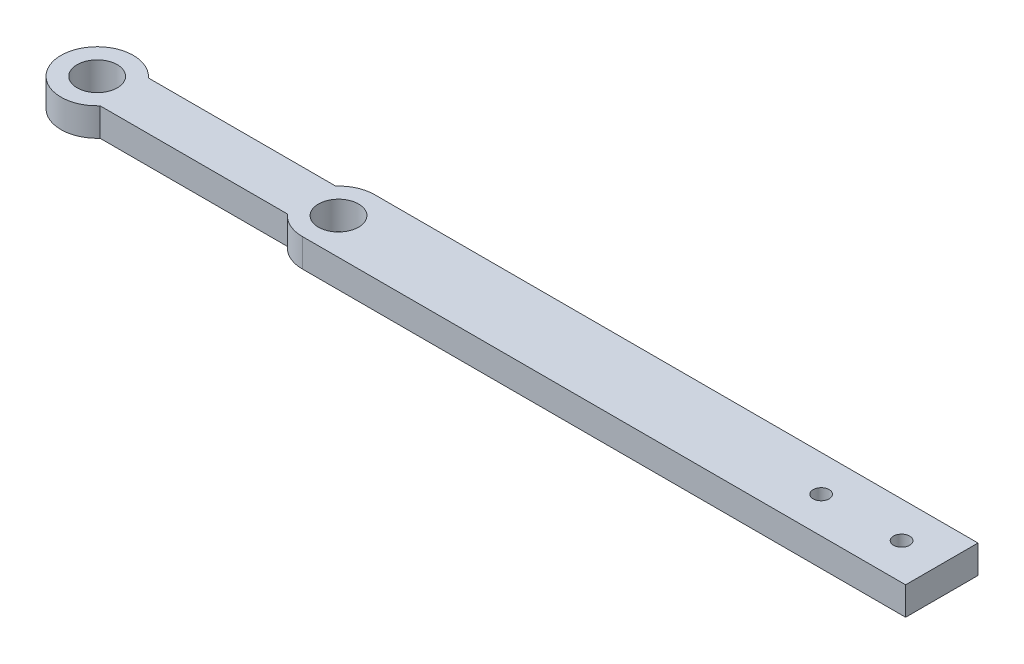
ISO-10303-21;
HEADER;
FILE_DESCRIPTION(('STEP AP214'),'2;1');
FILE_NAME('part.step','',(''),(''),'','','');
FILE_SCHEMA(('AUTOMOTIVE_DESIGN { 1 0 10303 214 1 1 1 1 }'));
ENDSEC;
DATA;
#1=APPLICATION_CONTEXT('core data for automotive mechanical design processes');
#2=APPLICATION_PROTOCOL_DEFINITION('international standard','automotive_design',2000,#1);
#3=PRODUCT_CONTEXT('',#1,'mechanical');
#4=PRODUCT('Part','Part','',(#3));
#5=PRODUCT_RELATED_PRODUCT_CATEGORY('part','',(#4));
#6=PRODUCT_DEFINITION_FORMATION('','',#4);
#7=PRODUCT_DEFINITION_CONTEXT('part definition',#1,'design');
#8=PRODUCT_DEFINITION('design','',#6,#7);
#9=PRODUCT_DEFINITION_SHAPE('','',#8);
#10=(LENGTH_UNIT() NAMED_UNIT(*) SI_UNIT(.MILLI.,.METRE.));
#11=(NAMED_UNIT(*) PLANE_ANGLE_UNIT() SI_UNIT($,.RADIAN.));
#12=(NAMED_UNIT(*) SI_UNIT($,.STERADIAN.) SOLID_ANGLE_UNIT());
#13=UNCERTAINTY_MEASURE_WITH_UNIT(LENGTH_MEASURE(1.E-05),#10,'distance_accuracy_value','');
#14=(GEOMETRIC_REPRESENTATION_CONTEXT(3) GLOBAL_UNCERTAINTY_ASSIGNED_CONTEXT((#13)) GLOBAL_UNIT_ASSIGNED_CONTEXT((#10,
#11,#12)) REPRESENTATION_CONTEXT('',''));
#15=CARTESIAN_POINT('',(0.,0.,0.));
#16=DIRECTION('',(0.,0.,1.));
#17=DIRECTION('',(1.,0.,0.));
#18=AXIS2_PLACEMENT_3D('',#15,#16,#17);
#19=CARTESIAN_POINT('',(60.,7.,0.));
#20=DIRECTION('',(0.,-1.,0.));
#21=DIRECTION('',(0.,0.,-1.));
#22=AXIS2_PLACEMENT_3D('',#19,#20,#21);
#23=CYLINDRICAL_SURFACE('',#22,9.);
#24=CARTESIAN_POINT('',(60.,0.,0.));
#25=DIRECTION('',(0.,1.,0.));
#26=DIRECTION('',(0.,0.,1.));
#27=AXIS2_PLACEMENT_3D('',#24,#25,#26);
#28=CIRCLE('',#27,9.);
#29=CARTESIAN_POINT('',(60.,0.,-9.));
#30=VERTEX_POINT('',#29);
#31=CARTESIAN_POINT('',(53.2917960675006,0.,-6.));
#32=VERTEX_POINT('',#31);
#33=EDGE_CURVE('E146',#30,#32,#28,.T.);
#34=ORIENTED_EDGE('',*,*,#33,.T.);
#35=DIRECTION('',(0.,-1.,0.));
#36=VECTOR('',#35,1.);
#37=CARTESIAN_POINT('',(53.2917960675006,7.,-6.));
#38=LINE('',#37,#36);
#39=CARTESIAN_POINT('',(53.2917960675006,7.,-6.));
#40=VERTEX_POINT('',#39);
#41=EDGE_CURVE('E11',#40,#32,#38,.T.);
#42=ORIENTED_EDGE('',*,*,#41,.F.);
#43=CARTESIAN_POINT('',(60.,7.,0.));
#44=DIRECTION('',(0.,1.,0.));
#45=DIRECTION('',(0.,0.,1.));
#46=AXIS2_PLACEMENT_3D('',#43,#44,#45);
#47=CIRCLE('',#46,9.);
#48=CARTESIAN_POINT('',(60.,7.,-9.));
#49=VERTEX_POINT('',#48);
#50=EDGE_CURVE('E169',#49,#40,#47,.T.);
#51=ORIENTED_EDGE('',*,*,#50,.F.);
#52=DIRECTION('',(0.,-1.,0.));
#53=VECTOR('',#52,1.);
#54=CARTESIAN_POINT('',(60.,7.,-9.));
#55=LINE('',#54,#53);
#56=EDGE_CURVE('E142',#49,#30,#55,.T.);
#57=ORIENTED_EDGE('',*,*,#56,.T.);
#58=EDGE_LOOP('',(#34,#42,#51,#57));
#59=FACE_BOUND('',#58,.T.);
#60=ADVANCED_FACE('F45',(#59),#23,.T.);
#61=CARTESIAN_POINT('',(6.70820393249937,7.,-6.));
#62=DIRECTION('',(0.,0.,1.));
#63=DIRECTION('',(1.,0.,0.));
#64=AXIS2_PLACEMENT_3D('',#61,#62,#63);
#65=PLANE('',#64);
#66=DIRECTION('',(-1.,0.,0.));
#67=VECTOR('',#66,1.);
#68=CARTESIAN_POINT('',(6.70820393249937,0.,-6.));
#69=LINE('',#68,#67);
#70=CARTESIAN_POINT('',(6.70820393249937,0.,-6.));
#71=VERTEX_POINT('',#70);
#72=EDGE_CURVE('E150',#32,#71,#69,.T.);
#73=ORIENTED_EDGE('',*,*,#72,.T.);
#74=DIRECTION('',(0.,-1.,0.));
#75=VECTOR('',#74,1.);
#76=CARTESIAN_POINT('',(6.70820393249937,7.,-6.));
#77=LINE('',#76,#75);
#78=CARTESIAN_POINT('',(6.70820393249937,7.,-6.));
#79=VERTEX_POINT('',#78);
#80=EDGE_CURVE('E54',#79,#71,#77,.T.);
#81=ORIENTED_EDGE('',*,*,#80,.F.);
#82=DIRECTION('',(-1.,0.,0.));
#83=VECTOR('',#82,1.);
#84=CARTESIAN_POINT('',(6.70820393249937,7.,-6.));
#85=LINE('',#84,#83);
#86=EDGE_CURVE('E105',#40,#79,#85,.T.);
#87=ORIENTED_EDGE('',*,*,#86,.F.);
#88=ORIENTED_EDGE('',*,*,#41,.T.);
#89=EDGE_LOOP('',(#73,#81,#87,#88));
#90=FACE_BOUND('',#89,.T.);
#91=ADVANCED_FACE('F279',(#90),#65,.F.);
#92=CARTESIAN_POINT('',(0.,7.,0.));
#93=DIRECTION('',(0.,-1.,0.));
#94=DIRECTION('',(0.,0.,-1.));
#95=AXIS2_PLACEMENT_3D('',#92,#93,#94);
#96=CYLINDRICAL_SURFACE('',#95,9.);
#97=CARTESIAN_POINT('',(0.,0.,0.));
#98=DIRECTION('',(0.,1.,0.));
#99=DIRECTION('',(0.,0.,1.));
#100=AXIS2_PLACEMENT_3D('',#97,#98,#99);
#101=CIRCLE('',#100,9.);
#102=CARTESIAN_POINT('',(6.70820393249937,0.,6.));
#103=VERTEX_POINT('',#102);
#104=EDGE_CURVE('E154',#71,#103,#101,.T.);
#105=ORIENTED_EDGE('',*,*,#104,.T.);
#106=DIRECTION('',(0.,-1.,0.));
#107=VECTOR('',#106,1.);
#108=CARTESIAN_POINT('',(6.70820393249937,7.,6.));
#109=LINE('',#108,#107);
#110=CARTESIAN_POINT('',(6.70820393249937,7.,6.));
#111=VERTEX_POINT('',#110);
#112=EDGE_CURVE('E180',#111,#103,#109,.T.);
#113=ORIENTED_EDGE('',*,*,#112,.F.);
#114=CARTESIAN_POINT('',(0.,7.,0.));
#115=DIRECTION('',(0.,1.,0.));
#116=DIRECTION('',(0.,0.,1.));
#117=AXIS2_PLACEMENT_3D('',#114,#115,#116);
#118=CIRCLE('',#117,9.);
#119=EDGE_CURVE('E190',#79,#111,#118,.T.);
#120=ORIENTED_EDGE('',*,*,#119,.F.);
#121=ORIENTED_EDGE('',*,*,#80,.T.);
#122=EDGE_LOOP('',(#105,#113,#120,#121));
#123=FACE_BOUND('',#122,.T.);
#124=ADVANCED_FACE('F188',(#123),#96,.T.);
#125=CARTESIAN_POINT('',(6.70820393249937,7.,6.));
#126=DIRECTION('',(0.,0.,-1.));
#127=DIRECTION('',(-1.,0.,0.));
#128=AXIS2_PLACEMENT_3D('',#125,#126,#127);
#129=PLANE('',#128);
#130=DIRECTION('',(1.,0.,0.));
#131=VECTOR('',#130,1.);
#132=CARTESIAN_POINT('',(6.70820393249937,0.,6.));
#133=LINE('',#132,#131);
#134=CARTESIAN_POINT('',(53.2917960675006,0.,6.));
#135=VERTEX_POINT('',#134);
#136=EDGE_CURVE('E157',#103,#135,#133,.T.);
#137=ORIENTED_EDGE('',*,*,#136,.T.);
#138=DIRECTION('',(0.,-1.,0.));
#139=VECTOR('',#138,1.);
#140=CARTESIAN_POINT('',(53.2917960675006,7.,6.));
#141=LINE('',#140,#139);
#142=CARTESIAN_POINT('',(53.2917960675006,7.,6.));
#143=VERTEX_POINT('',#142);
#144=EDGE_CURVE('E176',#143,#135,#141,.T.);
#145=ORIENTED_EDGE('',*,*,#144,.F.);
#146=DIRECTION('',(1.,0.,0.));
#147=VECTOR('',#146,1.);
#148=CARTESIAN_POINT('',(6.70820393249937,7.,6.));
#149=LINE('',#148,#147);
#150=EDGE_CURVE('E203',#111,#143,#149,.T.);
#151=ORIENTED_EDGE('',*,*,#150,.F.);
#152=ORIENTED_EDGE('',*,*,#112,.T.);
#153=EDGE_LOOP('',(#137,#145,#151,#152));
#154=FACE_BOUND('',#153,.T.);
#155=ADVANCED_FACE('F198',(#154),#129,.F.);
#156=CARTESIAN_POINT('',(60.,7.,0.));
#157=DIRECTION('',(0.,-1.,0.));
#158=DIRECTION('',(0.,0.,-1.));
#159=AXIS2_PLACEMENT_3D('',#156,#157,#158);
#160=CYLINDRICAL_SURFACE('',#159,9.);
#161=CARTESIAN_POINT('',(60.,0.,0.));
#162=DIRECTION('',(0.,1.,0.));
#163=DIRECTION('',(0.,0.,1.));
#164=AXIS2_PLACEMENT_3D('',#161,#162,#163);
#165=CIRCLE('',#164,9.);
#166=CARTESIAN_POINT('',(60.,0.,9.));
#167=VERTEX_POINT('',#166);
#168=EDGE_CURVE('E160',#135,#167,#165,.T.);
#169=ORIENTED_EDGE('',*,*,#168,.T.);
#170=DIRECTION('',(0.,-1.,0.));
#171=VECTOR('',#170,1.);
#172=CARTESIAN_POINT('',(60.,7.,9.));
#173=LINE('',#172,#171);
#174=CARTESIAN_POINT('',(60.,7.,9.));
#175=VERTEX_POINT('',#174);
#176=EDGE_CURVE('E135',#175,#167,#173,.T.);
#177=ORIENTED_EDGE('',*,*,#176,.F.);
#178=CARTESIAN_POINT('',(60.,7.,0.));
#179=DIRECTION('',(0.,1.,0.));
#180=DIRECTION('',(0.,0.,1.));
#181=AXIS2_PLACEMENT_3D('',#178,#179,#180);
#182=CIRCLE('',#181,9.);
#183=EDGE_CURVE('E124',#143,#175,#182,.T.);
#184=ORIENTED_EDGE('',*,*,#183,.F.);
#185=ORIENTED_EDGE('',*,*,#144,.T.);
#186=EDGE_LOOP('',(#169,#177,#184,#185));
#187=FACE_BOUND('',#186,.T.);
#188=ADVANCED_FACE('F201',(#187),#160,.T.);
#189=CARTESIAN_POINT('',(210.,7.,8.99999999999997));
#190=DIRECTION('',(0.,0.,-1.));
#191=DIRECTION('',(-1.,0.,0.));
#192=AXIS2_PLACEMENT_3D('',#189,#190,#191);
#193=PLANE('',#192);
#194=DIRECTION('',(1.,0.,0.));
#195=VECTOR('',#194,1.);
#196=CARTESIAN_POINT('',(210.,0.,8.99999999999997));
#197=LINE('',#196,#195);
#198=CARTESIAN_POINT('',(210.,0.,8.99999999999997));
#199=VERTEX_POINT('',#198);
#200=EDGE_CURVE('E133',#167,#199,#197,.T.);
#201=ORIENTED_EDGE('',*,*,#200,.T.);
#202=DIRECTION('',(0.,-1.,0.));
#203=VECTOR('',#202,1.);
#204=CARTESIAN_POINT('',(210.,7.,8.99999999999997));
#205=LINE('',#204,#203);
#206=CARTESIAN_POINT('',(210.,7.,8.99999999999997));
#207=VERTEX_POINT('',#206);
#208=EDGE_CURVE('E130',#207,#199,#205,.T.);
#209=ORIENTED_EDGE('',*,*,#208,.F.);
#210=DIRECTION('',(1.,0.,0.));
#211=VECTOR('',#210,1.);
#212=CARTESIAN_POINT('',(210.,7.,8.99999999999997));
#213=LINE('',#212,#211);
#214=EDGE_CURVE('E118',#175,#207,#213,.T.);
#215=ORIENTED_EDGE('',*,*,#214,.F.);
#216=ORIENTED_EDGE('',*,*,#176,.T.);
#217=EDGE_LOOP('',(#201,#209,#215,#216));
#218=FACE_BOUND('',#217,.T.);
#219=ADVANCED_FACE('F131',(#218),#193,.F.);
#220=CARTESIAN_POINT('',(210.,7.,-8.99999999999997));
#221=DIRECTION('',(-1.,0.,0.));
#222=DIRECTION('',(0.,0.,1.));
#223=AXIS2_PLACEMENT_3D('',#220,#221,#222);
#224=PLANE('',#223);
#225=DIRECTION('',(0.,0.,-1.));
#226=VECTOR('',#225,1.);
#227=CARTESIAN_POINT('',(210.,0.,-8.99999999999997));
#228=LINE('',#227,#226);
#229=CARTESIAN_POINT('',(210.,0.,-8.99999999999997));
#230=VERTEX_POINT('',#229);
#231=EDGE_CURVE('E91',#199,#230,#228,.T.);
#232=ORIENTED_EDGE('',*,*,#231,.T.);
#233=DIRECTION('',(0.,-1.,0.));
#234=VECTOR('',#233,1.);
#235=CARTESIAN_POINT('',(210.,7.,-8.99999999999997));
#236=LINE('',#235,#234);
#237=CARTESIAN_POINT('',(210.,7.,-8.99999999999997));
#238=VERTEX_POINT('',#237);
#239=EDGE_CURVE('E136',#238,#230,#236,.T.);
#240=ORIENTED_EDGE('',*,*,#239,.F.);
#241=DIRECTION('',(0.,0.,-1.));
#242=VECTOR('',#241,1.);
#243=CARTESIAN_POINT('',(210.,7.,-8.99999999999997));
#244=LINE('',#243,#242);
#245=EDGE_CURVE('E122',#207,#238,#244,.T.);
#246=ORIENTED_EDGE('',*,*,#245,.F.);
#247=ORIENTED_EDGE('',*,*,#208,.T.);
#248=EDGE_LOOP('',(#232,#240,#246,#247));
#249=FACE_BOUND('',#248,.T.);
#250=ADVANCED_FACE('F138',(#249),#224,.F.);
#251=CARTESIAN_POINT('',(60.,7.,-9.));
#252=DIRECTION('',(0.,0.,1.));
#253=DIRECTION('',(1.,0.,0.));
#254=AXIS2_PLACEMENT_3D('',#251,#252,#253);
#255=PLANE('',#254);
#256=DIRECTION('',(-1.,0.,0.));
#257=VECTOR('',#256,1.);
#258=CARTESIAN_POINT('',(60.,0.,-9.));
#259=LINE('',#258,#257);
#260=EDGE_CURVE('E97',#230,#30,#259,.T.);
#261=ORIENTED_EDGE('',*,*,#260,.T.);
#262=ORIENTED_EDGE('',*,*,#56,.F.);
#263=DIRECTION('',(-1.,0.,0.));
#264=VECTOR('',#263,1.);
#265=CARTESIAN_POINT('',(60.,7.,-9.));
#266=LINE('',#265,#264);
#267=EDGE_CURVE('E62',#238,#49,#266,.T.);
#268=ORIENTED_EDGE('',*,*,#267,.F.);
#269=ORIENTED_EDGE('',*,*,#239,.T.);
#270=EDGE_LOOP('',(#261,#262,#268,#269));
#271=FACE_BOUND('',#270,.T.);
#272=ADVANCED_FACE('F256',(#271),#255,.F.);
#273=CARTESIAN_POINT('',(60.,7.,0.));
#274=DIRECTION('',(0.,1.,0.));
#275=DIRECTION('',(0.,0.,1.));
#276=AXIS2_PLACEMENT_3D('',#273,#274,#275);
#277=PLANE('',#276);
#278=CARTESIAN_POINT('',(200.,7.,0.));
#279=DIRECTION('',(0.,1.,0.));
#280=DIRECTION('',(0.,0.,1.));
#281=AXIS2_PLACEMENT_3D('',#278,#279,#280);
#282=CIRCLE('',#281,2.);
#283=CARTESIAN_POINT('',(200.,7.,2.));
#284=VERTEX_POINT('',#283);
#285=EDGE_CURVE('E237',#284,#284,#282,.T.);
#286=ORIENTED_EDGE('',*,*,#285,.F.);
#287=EDGE_LOOP('',(#286));
#288=FACE_BOUND('',#287,.T.);
#289=CARTESIAN_POINT('',(180.,7.,0.));
#290=DIRECTION('',(0.,1.,0.));
#291=DIRECTION('',(0.,0.,1.));
#292=AXIS2_PLACEMENT_3D('',#289,#290,#291);
#293=CIRCLE('',#292,2.);
#294=CARTESIAN_POINT('',(180.,7.,2.));
#295=VERTEX_POINT('',#294);
#296=EDGE_CURVE('E233',#295,#295,#293,.T.);
#297=ORIENTED_EDGE('',*,*,#296,.F.);
#298=EDGE_LOOP('',(#297));
#299=FACE_BOUND('',#298,.T.);
#300=CARTESIAN_POINT('',(0.,7.,0.));
#301=DIRECTION('',(0.,1.,0.));
#302=DIRECTION('',(0.,0.,1.));
#303=AXIS2_PLACEMENT_3D('',#300,#301,#302);
#304=CIRCLE('',#303,5.);
#305=CARTESIAN_POINT('',(0.,7.,5.));
#306=VERTEX_POINT('',#305);
#307=EDGE_CURVE('E222',#306,#306,#304,.T.);
#308=ORIENTED_EDGE('',*,*,#307,.F.);
#309=EDGE_LOOP('',(#308));
#310=FACE_BOUND('',#309,.T.);
#311=CARTESIAN_POINT('',(60.,7.,0.));
#312=DIRECTION('',(0.,1.,0.));
#313=DIRECTION('',(0.,0.,1.));
#314=AXIS2_PLACEMENT_3D('',#311,#312,#313);
#315=CIRCLE('',#314,5.);
#316=CARTESIAN_POINT('',(60.,7.,5.));
#317=VERTEX_POINT('',#316);
#318=EDGE_CURVE('E217',#317,#317,#315,.T.);
#319=ORIENTED_EDGE('',*,*,#318,.F.);
#320=EDGE_LOOP('',(#319));
#321=FACE_BOUND('',#320,.T.);
#322=ORIENTED_EDGE('',*,*,#50,.T.);
#323=ORIENTED_EDGE('',*,*,#86,.T.);
#324=ORIENTED_EDGE('',*,*,#119,.T.);
#325=ORIENTED_EDGE('',*,*,#150,.T.);
#326=ORIENTED_EDGE('',*,*,#183,.T.);
#327=ORIENTED_EDGE('',*,*,#214,.T.);
#328=ORIENTED_EDGE('',*,*,#245,.T.);
#329=ORIENTED_EDGE('',*,*,#267,.T.);
#330=EDGE_LOOP('',(#322,#323,#324,#325,#326,#327,#328,#329));
#331=FACE_BOUND('',#330,.T.);
#332=ADVANCED_FACE('F120',(#288,#299,#310,#321,#331),#277,.T.);
#333=CARTESIAN_POINT('',(60.,0.,0.));
#334=DIRECTION('',(0.,1.,0.));
#335=DIRECTION('',(0.,0.,1.));
#336=AXIS2_PLACEMENT_3D('',#333,#334,#335);
#337=PLANE('',#336);
#338=CARTESIAN_POINT('',(200.,0.,0.));
#339=DIRECTION('',(0.,1.,0.));
#340=DIRECTION('',(0.,0.,1.));
#341=AXIS2_PLACEMENT_3D('',#338,#339,#340);
#342=CIRCLE('',#341,2.);
#343=CARTESIAN_POINT('',(200.,0.,2.));
#344=VERTEX_POINT('',#343);
#345=EDGE_CURVE('E218',#344,#344,#342,.T.);
#346=ORIENTED_EDGE('',*,*,#345,.T.);
#347=EDGE_LOOP('',(#346));
#348=FACE_BOUND('',#347,.T.);
#349=CARTESIAN_POINT('',(180.,0.,0.));
#350=DIRECTION('',(0.,1.,0.));
#351=DIRECTION('',(0.,0.,1.));
#352=AXIS2_PLACEMENT_3D('',#349,#350,#351);
#353=CIRCLE('',#352,2.);
#354=CARTESIAN_POINT('',(180.,0.,2.));
#355=VERTEX_POINT('',#354);
#356=EDGE_CURVE('E229',#355,#355,#353,.T.);
#357=ORIENTED_EDGE('',*,*,#356,.T.);
#358=EDGE_LOOP('',(#357));
#359=FACE_BOUND('',#358,.T.);
#360=CARTESIAN_POINT('',(0.,0.,0.));
#361=DIRECTION('',(0.,1.,0.));
#362=DIRECTION('',(0.,0.,1.));
#363=AXIS2_PLACEMENT_3D('',#360,#361,#362);
#364=CIRCLE('',#363,5.);
#365=CARTESIAN_POINT('',(0.,0.,5.));
#366=VERTEX_POINT('',#365);
#367=EDGE_CURVE('E151',#366,#366,#364,.T.);
#368=ORIENTED_EDGE('',*,*,#367,.T.);
#369=EDGE_LOOP('',(#368));
#370=FACE_BOUND('',#369,.T.);
#371=CARTESIAN_POINT('',(60.,0.,0.));
#372=DIRECTION('',(0.,1.,0.));
#373=DIRECTION('',(0.,0.,1.));
#374=AXIS2_PLACEMENT_3D('',#371,#372,#373);
#375=CIRCLE('',#374,5.);
#376=CARTESIAN_POINT('',(60.,0.,5.));
#377=VERTEX_POINT('',#376);
#378=EDGE_CURVE('E213',#377,#377,#375,.T.);
#379=ORIENTED_EDGE('',*,*,#378,.T.);
#380=EDGE_LOOP('',(#379));
#381=FACE_BOUND('',#380,.T.);
#382=ORIENTED_EDGE('',*,*,#33,.F.);
#383=ORIENTED_EDGE('',*,*,#260,.F.);
#384=ORIENTED_EDGE('',*,*,#231,.F.);
#385=ORIENTED_EDGE('',*,*,#200,.F.);
#386=ORIENTED_EDGE('',*,*,#168,.F.);
#387=ORIENTED_EDGE('',*,*,#136,.F.);
#388=ORIENTED_EDGE('',*,*,#104,.F.);
#389=ORIENTED_EDGE('',*,*,#72,.F.);
#390=EDGE_LOOP('',(#382,#383,#384,#385,#386,#387,#388,#389));
#391=FACE_BOUND('',#390,.T.);
#392=ADVANCED_FACE('F194',(#348,#359,#370,#381,#391),#337,.F.);
#393=CARTESIAN_POINT('',(60.,0.,0.));
#394=DIRECTION('',(0.,1.,0.));
#395=DIRECTION('',(0.,0.,1.));
#396=AXIS2_PLACEMENT_3D('',#393,#394,#395);
#397=CYLINDRICAL_SURFACE('',#396,5.);
#398=ORIENTED_EDGE('',*,*,#378,.F.);
#399=EDGE_LOOP('',(#398));
#400=FACE_BOUND('',#399,.T.);
#401=ORIENTED_EDGE('',*,*,#318,.T.);
#402=EDGE_LOOP('',(#401));
#403=FACE_BOUND('',#402,.T.);
#404=ADVANCED_FACE('F264',(#400,#403),#397,.F.);
#405=CARTESIAN_POINT('',(0.,0.,0.));
#406=DIRECTION('',(0.,1.,0.));
#407=DIRECTION('',(0.,0.,1.));
#408=AXIS2_PLACEMENT_3D('',#405,#406,#407);
#409=CYLINDRICAL_SURFACE('',#408,5.);
#410=ORIENTED_EDGE('',*,*,#367,.F.);
#411=EDGE_LOOP('',(#410));
#412=FACE_BOUND('',#411,.T.);
#413=ORIENTED_EDGE('',*,*,#307,.T.);
#414=EDGE_LOOP('',(#413));
#415=FACE_BOUND('',#414,.T.);
#416=ADVANCED_FACE('F266',(#412,#415),#409,.F.);
#417=CARTESIAN_POINT('',(180.,0.,0.));
#418=DIRECTION('',(0.,1.,0.));
#419=DIRECTION('',(0.,0.,1.));
#420=AXIS2_PLACEMENT_3D('',#417,#418,#419);
#421=CYLINDRICAL_SURFACE('',#420,2.);
#422=ORIENTED_EDGE('',*,*,#356,.F.);
#423=EDGE_LOOP('',(#422));
#424=FACE_BOUND('',#423,.T.);
#425=ORIENTED_EDGE('',*,*,#296,.T.);
#426=EDGE_LOOP('',(#425));
#427=FACE_BOUND('',#426,.T.);
#428=ADVANCED_FACE('F250',(#424,#427),#421,.F.);
#429=CARTESIAN_POINT('',(200.,0.,0.));
#430=DIRECTION('',(0.,1.,0.));
#431=DIRECTION('',(0.,0.,1.));
#432=AXIS2_PLACEMENT_3D('',#429,#430,#431);
#433=CYLINDRICAL_SURFACE('',#432,2.);
#434=ORIENTED_EDGE('',*,*,#345,.F.);
#435=EDGE_LOOP('',(#434));
#436=FACE_BOUND('',#435,.T.);
#437=ORIENTED_EDGE('',*,*,#285,.T.);
#438=EDGE_LOOP('',(#437));
#439=FACE_BOUND('',#438,.T.);
#440=ADVANCED_FACE('F247',(#436,#439),#433,.F.);
#441=CLOSED_SHELL('',(#60,#91,#124,#155,#188,#219,#250,#272,#332,#392,#404,#416,#428,#440));
#442=MANIFOLD_SOLID_BREP('B2',#441);
#443=ADVANCED_BREP_SHAPE_REPRESENTATION('',(#18,#442),#14);
#444=SHAPE_DEFINITION_REPRESENTATION(#9,#443);
ENDSEC;
END-ISO-10303-21;
